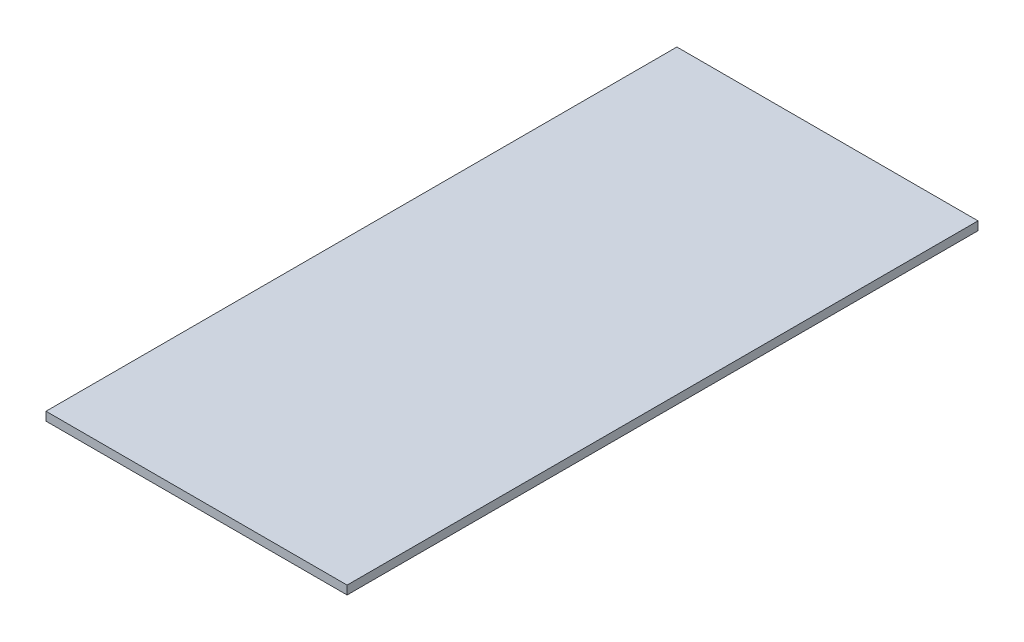
ISO-10303-21;
HEADER;
FILE_DESCRIPTION(('STEP AP214'),'2;1');
FILE_NAME('part.step','',(''),(''),'','','');
FILE_SCHEMA(('AUTOMOTIVE_DESIGN { 1 0 10303 214 1 1 1 1 }'));
ENDSEC;
DATA;
#1=APPLICATION_CONTEXT('core data for automotive mechanical design processes');
#2=APPLICATION_PROTOCOL_DEFINITION('international standard','automotive_design',2000,#1);
#3=PRODUCT_CONTEXT('',#1,'mechanical');
#4=PRODUCT('Part','Part','',(#3));
#5=PRODUCT_RELATED_PRODUCT_CATEGORY('part','',(#4));
#6=PRODUCT_DEFINITION_FORMATION('','',#4);
#7=PRODUCT_DEFINITION_CONTEXT('part definition',#1,'design');
#8=PRODUCT_DEFINITION('design','',#6,#7);
#9=PRODUCT_DEFINITION_SHAPE('','',#8);
#10=(LENGTH_UNIT() NAMED_UNIT(*) SI_UNIT(.MILLI.,.METRE.));
#11=(NAMED_UNIT(*) PLANE_ANGLE_UNIT() SI_UNIT($,.RADIAN.));
#12=(NAMED_UNIT(*) SI_UNIT($,.STERADIAN.) SOLID_ANGLE_UNIT());
#13=UNCERTAINTY_MEASURE_WITH_UNIT(LENGTH_MEASURE(1.E-05),#10,'distance_accuracy_value','');
#14=(GEOMETRIC_REPRESENTATION_CONTEXT(3) GLOBAL_UNCERTAINTY_ASSIGNED_CONTEXT((#13)) GLOBAL_UNIT_ASSIGNED_CONTEXT((#10,
#11,#12)) REPRESENTATION_CONTEXT('',''));
#15=CARTESIAN_POINT('',(0.,0.,0.));
#16=DIRECTION('',(0.,0.,1.));
#17=DIRECTION('',(1.,0.,0.));
#18=AXIS2_PLACEMENT_3D('',#15,#16,#17);
#19=CARTESIAN_POINT('',(52.5,3.,-110.));
#20=DIRECTION('',(-1.,0.,0.));
#21=DIRECTION('',(0.,0.,1.));
#22=AXIS2_PLACEMENT_3D('',#19,#20,#21);
#23=PLANE('',#22);
#24=DIRECTION('',(0.,0.,-1.));
#25=VECTOR('',#24,1.);
#26=CARTESIAN_POINT('',(52.5,0.,-110.));
#27=LINE('',#26,#25);
#28=CARTESIAN_POINT('',(52.5,0.,110.));
#29=VERTEX_POINT('',#28);
#30=CARTESIAN_POINT('',(52.5,0.,-110.));
#31=VERTEX_POINT('',#30);
#32=EDGE_CURVE('E96',#29,#31,#27,.T.);
#33=ORIENTED_EDGE('',*,*,#32,.T.);
#34=DIRECTION('',(0.,-1.,0.));
#35=VECTOR('',#34,1.);
#36=CARTESIAN_POINT('',(52.5,3.,-110.));
#37=LINE('',#36,#35);
#38=CARTESIAN_POINT('',(52.5,3.,-110.));
#39=VERTEX_POINT('',#38);
#40=EDGE_CURVE('E11',#39,#31,#37,.T.);
#41=ORIENTED_EDGE('',*,*,#40,.F.);
#42=DIRECTION('',(0.,0.,-1.));
#43=VECTOR('',#42,1.);
#44=CARTESIAN_POINT('',(52.5,3.,-110.));
#45=LINE('',#44,#43);
#46=CARTESIAN_POINT('',(52.5,3.,110.));
#47=VERTEX_POINT('',#46);
#48=EDGE_CURVE('E84',#47,#39,#45,.T.);
#49=ORIENTED_EDGE('',*,*,#48,.F.);
#50=DIRECTION('',(0.,-1.,0.));
#51=VECTOR('',#50,1.);
#52=CARTESIAN_POINT('',(52.5,3.,110.));
#53=LINE('',#52,#51);
#54=EDGE_CURVE('E92',#47,#29,#53,.T.);
#55=ORIENTED_EDGE('',*,*,#54,.T.);
#56=EDGE_LOOP('',(#33,#41,#49,#55));
#57=FACE_BOUND('',#56,.T.);
#58=ADVANCED_FACE('F33',(#57),#23,.F.);
#59=CARTESIAN_POINT('',(-52.5,3.,-110.));
#60=DIRECTION('',(0.,0.,1.));
#61=DIRECTION('',(1.,0.,0.));
#62=AXIS2_PLACEMENT_3D('',#59,#60,#61);
#63=PLANE('',#62);
#64=DIRECTION('',(-1.,0.,0.));
#65=VECTOR('',#64,1.);
#66=CARTESIAN_POINT('',(-52.5,0.,-110.));
#67=LINE('',#66,#65);
#68=CARTESIAN_POINT('',(-52.5,0.,-110.));
#69=VERTEX_POINT('',#68);
#70=EDGE_CURVE('E88',#31,#69,#67,.T.);
#71=ORIENTED_EDGE('',*,*,#70,.T.);
#72=DIRECTION('',(0.,-1.,0.));
#73=VECTOR('',#72,1.);
#74=CARTESIAN_POINT('',(-52.5,3.,-110.));
#75=LINE('',#74,#73);
#76=CARTESIAN_POINT('',(-52.5,3.,-110.));
#77=VERTEX_POINT('',#76);
#78=EDGE_CURVE('E41',#77,#69,#75,.T.);
#79=ORIENTED_EDGE('',*,*,#78,.F.);
#80=DIRECTION('',(-1.,0.,0.));
#81=VECTOR('',#80,1.);
#82=CARTESIAN_POINT('',(-52.5,3.,-110.));
#83=LINE('',#82,#81);
#84=EDGE_CURVE('E79',#39,#77,#83,.T.);
#85=ORIENTED_EDGE('',*,*,#84,.F.);
#86=ORIENTED_EDGE('',*,*,#40,.T.);
#87=EDGE_LOOP('',(#71,#79,#85,#86));
#88=FACE_BOUND('',#87,.T.);
#89=ADVANCED_FACE('F87',(#88),#63,.F.);
#90=CARTESIAN_POINT('',(-52.5,3.,-110.));
#91=DIRECTION('',(1.,0.,0.));
#92=DIRECTION('',(0.,0.,-1.));
#93=AXIS2_PLACEMENT_3D('',#90,#91,#92);
#94=PLANE('',#93);
#95=DIRECTION('',(0.,0.,1.));
#96=VECTOR('',#95,1.);
#97=CARTESIAN_POINT('',(-52.5,0.,-110.));
#98=LINE('',#97,#96);
#99=CARTESIAN_POINT('',(-52.5,0.,110.));
#100=VERTEX_POINT('',#99);
#101=EDGE_CURVE('E66',#69,#100,#98,.T.);
#102=ORIENTED_EDGE('',*,*,#101,.T.);
#103=DIRECTION('',(0.,-1.,0.));
#104=VECTOR('',#103,1.);
#105=CARTESIAN_POINT('',(-52.5,3.,110.));
#106=LINE('',#105,#104);
#107=CARTESIAN_POINT('',(-52.5,3.,110.));
#108=VERTEX_POINT('',#107);
#109=EDGE_CURVE('E89',#108,#100,#106,.T.);
#110=ORIENTED_EDGE('',*,*,#109,.F.);
#111=DIRECTION('',(0.,0.,1.));
#112=VECTOR('',#111,1.);
#113=CARTESIAN_POINT('',(-52.5,3.,-110.));
#114=LINE('',#113,#112);
#115=EDGE_CURVE('E82',#77,#108,#114,.T.);
#116=ORIENTED_EDGE('',*,*,#115,.F.);
#117=ORIENTED_EDGE('',*,*,#78,.T.);
#118=EDGE_LOOP('',(#102,#110,#116,#117));
#119=FACE_BOUND('',#118,.T.);
#120=ADVANCED_FACE('F90',(#119),#94,.F.);
#121=CARTESIAN_POINT('',(-52.5,3.,110.));
#122=DIRECTION('',(0.,0.,-1.));
#123=DIRECTION('',(-1.,0.,0.));
#124=AXIS2_PLACEMENT_3D('',#121,#122,#123);
#125=PLANE('',#124);
#126=DIRECTION('',(1.,0.,0.));
#127=VECTOR('',#126,1.);
#128=CARTESIAN_POINT('',(-52.5,0.,110.));
#129=LINE('',#128,#127);
#130=EDGE_CURVE('E72',#100,#29,#129,.T.);
#131=ORIENTED_EDGE('',*,*,#130,.T.);
#132=ORIENTED_EDGE('',*,*,#54,.F.);
#133=DIRECTION('',(1.,0.,0.));
#134=VECTOR('',#133,1.);
#135=CARTESIAN_POINT('',(-52.5,3.,110.));
#136=LINE('',#135,#134);
#137=EDGE_CURVE('E49',#108,#47,#136,.T.);
#138=ORIENTED_EDGE('',*,*,#137,.F.);
#139=ORIENTED_EDGE('',*,*,#109,.T.);
#140=EDGE_LOOP('',(#131,#132,#138,#139));
#141=FACE_BOUND('',#140,.T.);
#142=ADVANCED_FACE('F103',(#141),#125,.F.);
#143=CARTESIAN_POINT('',(0.,3.,0.));
#144=DIRECTION('',(0.,1.,0.));
#145=DIRECTION('',(0.,0.,1.));
#146=AXIS2_PLACEMENT_3D('',#143,#144,#145);
#147=PLANE('',#146);
#148=ORIENTED_EDGE('',*,*,#48,.T.);
#149=ORIENTED_EDGE('',*,*,#84,.T.);
#150=ORIENTED_EDGE('',*,*,#115,.T.);
#151=ORIENTED_EDGE('',*,*,#137,.T.);
#152=EDGE_LOOP('',(#148,#149,#150,#151));
#153=FACE_BOUND('',#152,.T.);
#154=ADVANCED_FACE('F80',(#153),#147,.T.);
#155=CARTESIAN_POINT('',(0.,0.,0.));
#156=DIRECTION('',(0.,1.,0.));
#157=DIRECTION('',(0.,0.,1.));
#158=AXIS2_PLACEMENT_3D('',#155,#156,#157);
#159=PLANE('',#158);
#160=ORIENTED_EDGE('',*,*,#32,.F.);
#161=ORIENTED_EDGE('',*,*,#130,.F.);
#162=ORIENTED_EDGE('',*,*,#101,.F.);
#163=ORIENTED_EDGE('',*,*,#70,.F.);
#164=EDGE_LOOP('',(#160,#161,#162,#163));
#165=FACE_BOUND('',#164,.T.);
#166=ADVANCED_FACE('F106',(#165),#159,.F.);
#167=CLOSED_SHELL('',(#58,#89,#120,#142,#154,#166));
#168=MANIFOLD_SOLID_BREP('B2',#167);
#169=ADVANCED_BREP_SHAPE_REPRESENTATION('',(#18,#168),#14);
#170=SHAPE_DEFINITION_REPRESENTATION(#9,#169);
ENDSEC;
END-ISO-10303-21;
